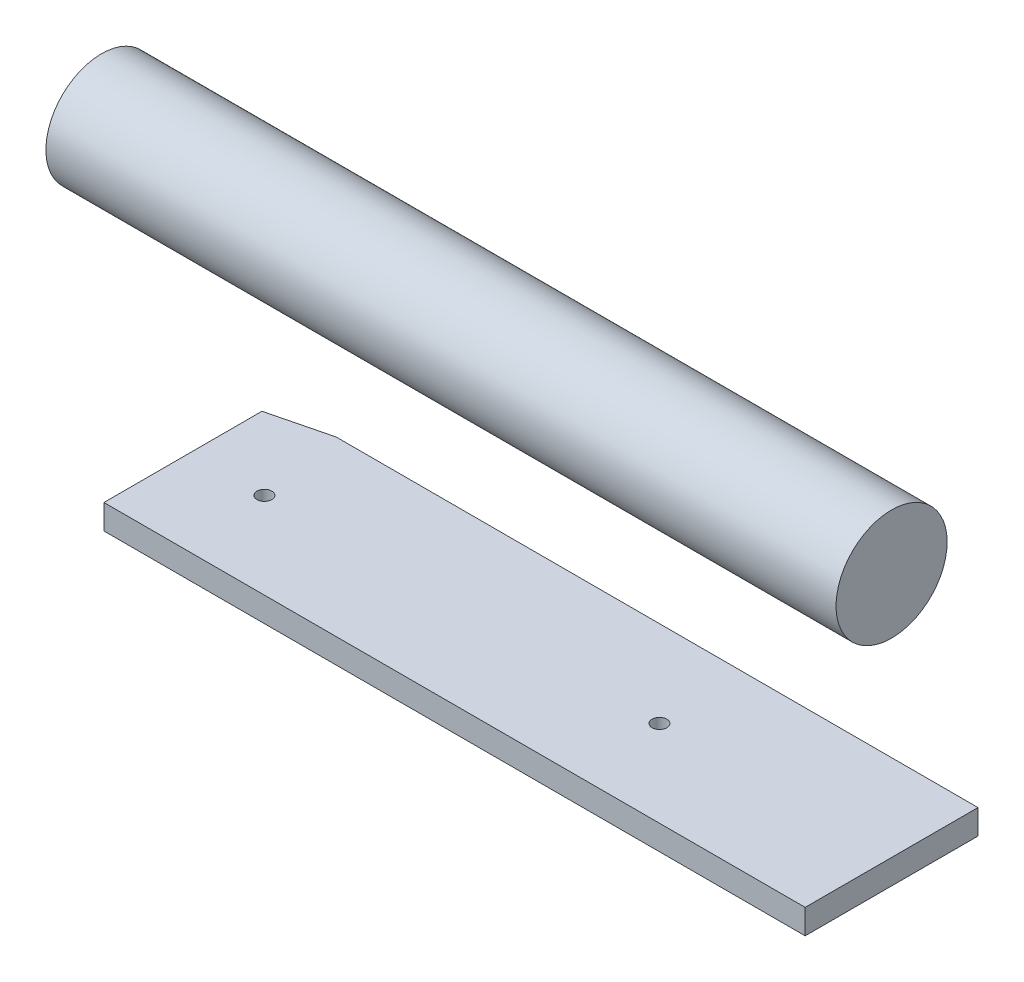
ISO-10303-21;
HEADER;
FILE_DESCRIPTION(('STEP AP214'),'2;1');
FILE_NAME('part.step','',(''),(''),'','','');
FILE_SCHEMA(('AUTOMOTIVE_DESIGN { 1 0 10303 214 1 1 1 1 }'));
ENDSEC;
DATA;
#1=APPLICATION_CONTEXT('core data for automotive mechanical design processes');
#2=APPLICATION_PROTOCOL_DEFINITION('international standard','automotive_design',2000,#1);
#3=PRODUCT_CONTEXT('',#1,'mechanical');
#4=PRODUCT('Part','Part','',(#3));
#5=PRODUCT_RELATED_PRODUCT_CATEGORY('part','',(#4));
#6=PRODUCT_DEFINITION_FORMATION('','',#4);
#7=PRODUCT_DEFINITION_CONTEXT('part definition',#1,'design');
#8=PRODUCT_DEFINITION('design','',#6,#7);
#9=PRODUCT_DEFINITION_SHAPE('','',#8);
#10=(LENGTH_UNIT() NAMED_UNIT(*) SI_UNIT(.MILLI.,.METRE.));
#11=(NAMED_UNIT(*) PLANE_ANGLE_UNIT() SI_UNIT($,.RADIAN.));
#12=(NAMED_UNIT(*) SI_UNIT($,.STERADIAN.) SOLID_ANGLE_UNIT());
#13=UNCERTAINTY_MEASURE_WITH_UNIT(LENGTH_MEASURE(1.E-05),#10,'distance_accuracy_value','');
#14=(GEOMETRIC_REPRESENTATION_CONTEXT(3) GLOBAL_UNCERTAINTY_ASSIGNED_CONTEXT((#13)) GLOBAL_UNIT_ASSIGNED_CONTEXT((#10,
#11,#12)) REPRESENTATION_CONTEXT('',''));
#15=CARTESIAN_POINT('',(0.,0.,0.));
#16=DIRECTION('',(0.,0.,1.));
#17=DIRECTION('',(1.,0.,0.));
#18=AXIS2_PLACEMENT_3D('',#15,#16,#17);
#19=CARTESIAN_POINT('',(0.,5.,0.));
#20=DIRECTION('',(0.,1.,0.));
#21=DIRECTION('',(0.,0.,1.));
#22=AXIS2_PLACEMENT_3D('',#19,#20,#21);
#23=PLANE('',#22);
#24=CARTESIAN_POINT('',(33.,5.,0.));
#25=DIRECTION('',(0.,1.,0.));
#26=DIRECTION('',(0.,0.,1.));
#27=AXIS2_PLACEMENT_3D('',#24,#25,#26);
#28=CIRCLE('',#27,1.5);
#29=CARTESIAN_POINT('',(33.,5.,1.50000000000002));
#30=VERTEX_POINT('',#29);
#31=EDGE_CURVE('E121',#30,#30,#28,.T.);
#32=ORIENTED_EDGE('',*,*,#31,.F.);
#33=EDGE_LOOP('',(#32));
#34=FACE_BOUND('',#33,.T.);
#35=DIRECTION('',(0.,0.,-1.));
#36=VECTOR('',#35,1.);
#37=CARTESIAN_POINT('',(160.,5.,17.5));
#38=LINE('',#37,#36);
#39=CARTESIAN_POINT('',(160.,5.,17.5));
#40=VERTEX_POINT('',#39);
#41=CARTESIAN_POINT('',(160.,5.,-17.5));
#42=VERTEX_POINT('',#41);
#43=EDGE_CURVE('E126',#40,#42,#38,.T.);
#44=ORIENTED_EDGE('',*,*,#43,.T.);
#45=DIRECTION('',(-1.,0.,0.));
#46=VECTOR('',#45,1.);
#47=CARTESIAN_POINT('',(160.,5.,-17.5));
#48=LINE('',#47,#46);
#49=CARTESIAN_POINT('',(30.0323428006067,5.,-17.5));
#50=VERTEX_POINT('',#49);
#51=EDGE_CURVE('E93',#42,#50,#48,.T.);
#52=ORIENTED_EDGE('',*,*,#51,.T.);
#53=DIRECTION('',(-0.970295726275993,0.,0.241921895599681));
#54=VECTOR('',#53,1.);
#55=CARTESIAN_POINT('',(18.,5.,-14.5));
#56=LINE('',#55,#54);
#57=CARTESIAN_POINT('',(18.,5.,-14.5));
#58=VERTEX_POINT('',#57);
#59=EDGE_CURVE('E97',#50,#58,#56,.T.);
#60=ORIENTED_EDGE('',*,*,#59,.T.);
#61=DIRECTION('',(0.,0.,1.));
#62=VECTOR('',#61,1.);
#63=CARTESIAN_POINT('',(18.,5.,-14.5));
#64=LINE('',#63,#62);
#65=CARTESIAN_POINT('',(18.,5.,17.5));
#66=VERTEX_POINT('',#65);
#67=EDGE_CURVE('E101',#58,#66,#64,.T.);
#68=ORIENTED_EDGE('',*,*,#67,.T.);
#69=DIRECTION('',(1.,0.,0.));
#70=VECTOR('',#69,1.);
#71=CARTESIAN_POINT('',(18.,5.,17.5));
#72=LINE('',#71,#70);
#73=EDGE_CURVE('E59',#66,#40,#72,.T.);
#74=ORIENTED_EDGE('',*,*,#73,.T.);
#75=EDGE_LOOP('',(#44,#52,#60,#68,#74));
#76=FACE_BOUND('',#75,.T.);
#77=CARTESIAN_POINT('',(113.,5.,0.));
#78=DIRECTION('',(0.,1.,0.));
#79=DIRECTION('',(0.,0.,1.));
#80=AXIS2_PLACEMENT_3D('',#77,#78,#79);
#81=CIRCLE('',#80,1.5);
#82=CARTESIAN_POINT('',(113.,5.,1.50000000000001));
#83=VERTEX_POINT('',#82);
#84=EDGE_CURVE('E164',#83,#83,#81,.T.);
#85=ORIENTED_EDGE('',*,*,#84,.F.);
#86=EDGE_LOOP('',(#85));
#87=FACE_BOUND('',#86,.T.);
#88=ADVANCED_FACE('F42',(#34,#76,#87),#23,.T.);
#89=CARTESIAN_POINT('',(0.,0.,0.));
#90=DIRECTION('',(0.,1.,0.));
#91=DIRECTION('',(0.,0.,1.));
#92=AXIS2_PLACEMENT_3D('',#89,#90,#91);
#93=PLANE('',#92);
#94=CARTESIAN_POINT('',(33.,0.,0.));
#95=DIRECTION('',(0.,1.,0.));
#96=DIRECTION('',(0.,0.,1.));
#97=AXIS2_PLACEMENT_3D('',#94,#95,#96);
#98=CIRCLE('',#97,1.5);
#99=CARTESIAN_POINT('',(33.,0.,1.50000000000002));
#100=VERTEX_POINT('',#99);
#101=EDGE_CURVE('E169',#100,#100,#98,.T.);
#102=ORIENTED_EDGE('',*,*,#101,.T.);
#103=EDGE_LOOP('',(#102));
#104=FACE_BOUND('',#103,.T.);
#105=DIRECTION('',(0.,0.,-1.));
#106=VECTOR('',#105,1.);
#107=CARTESIAN_POINT('',(160.,0.,17.5));
#108=LINE('',#107,#106);
#109=CARTESIAN_POINT('',(160.,0.,17.5));
#110=VERTEX_POINT('',#109);
#111=CARTESIAN_POINT('',(160.,0.,-17.5));
#112=VERTEX_POINT('',#111);
#113=EDGE_CURVE('E117',#110,#112,#108,.T.);
#114=ORIENTED_EDGE('',*,*,#113,.F.);
#115=DIRECTION('',(1.,0.,0.));
#116=VECTOR('',#115,1.);
#117=CARTESIAN_POINT('',(18.,0.,17.5));
#118=LINE('',#117,#116);
#119=CARTESIAN_POINT('',(18.,0.,17.5));
#120=VERTEX_POINT('',#119);
#121=EDGE_CURVE('E85',#120,#110,#118,.T.);
#122=ORIENTED_EDGE('',*,*,#121,.F.);
#123=DIRECTION('',(0.,0.,1.));
#124=VECTOR('',#123,1.);
#125=CARTESIAN_POINT('',(18.,0.,-14.5));
#126=LINE('',#125,#124);
#127=CARTESIAN_POINT('',(18.,0.,-14.5));
#128=VERTEX_POINT('',#127);
#129=EDGE_CURVE('E79',#128,#120,#126,.T.);
#130=ORIENTED_EDGE('',*,*,#129,.F.);
#131=DIRECTION('',(-0.970295726275993,0.,0.241921895599681));
#132=VECTOR('',#131,1.);
#133=CARTESIAN_POINT('',(18.,0.,-14.5));
#134=LINE('',#133,#132);
#135=CARTESIAN_POINT('',(30.0323428006067,0.,-17.5));
#136=VERTEX_POINT('',#135);
#137=EDGE_CURVE('E108',#136,#128,#134,.T.);
#138=ORIENTED_EDGE('',*,*,#137,.F.);
#139=DIRECTION('',(-1.,0.,0.));
#140=VECTOR('',#139,1.);
#141=CARTESIAN_POINT('',(160.,0.,-17.5));
#142=LINE('',#141,#140);
#143=EDGE_CURVE('E120',#112,#136,#142,.T.);
#144=ORIENTED_EDGE('',*,*,#143,.F.);
#145=EDGE_LOOP('',(#114,#122,#130,#138,#144));
#146=FACE_BOUND('',#145,.T.);
#147=CARTESIAN_POINT('',(113.,0.,0.));
#148=DIRECTION('',(0.,1.,0.));
#149=DIRECTION('',(0.,0.,1.));
#150=AXIS2_PLACEMENT_3D('',#147,#148,#149);
#151=CIRCLE('',#150,1.5);
#152=CARTESIAN_POINT('',(113.,0.,1.50000000000001));
#153=VERTEX_POINT('',#152);
#154=EDGE_CURVE('E167',#153,#153,#151,.T.);
#155=ORIENTED_EDGE('',*,*,#154,.T.);
#156=EDGE_LOOP('',(#155));
#157=FACE_BOUND('',#156,.T.);
#158=ADVANCED_FACE('F130',(#104,#146,#157),#93,.F.);
#159=CARTESIAN_POINT('',(160.,5.,17.5));
#160=DIRECTION('',(-1.,0.,0.));
#161=DIRECTION('',(0.,0.,1.));
#162=AXIS2_PLACEMENT_3D('',#159,#160,#161);
#163=PLANE('',#162);
#164=ORIENTED_EDGE('',*,*,#113,.T.);
#165=DIRECTION('',(0.,-1.,0.));
#166=VECTOR('',#165,1.);
#167=CARTESIAN_POINT('',(160.,5.,-17.5));
#168=LINE('',#167,#166);
#169=EDGE_CURVE('E12',#42,#112,#168,.T.);
#170=ORIENTED_EDGE('',*,*,#169,.F.);
#171=ORIENTED_EDGE('',*,*,#43,.F.);
#172=DIRECTION('',(0.,-1.,0.));
#173=VECTOR('',#172,1.);
#174=CARTESIAN_POINT('',(160.,5.,17.5));
#175=LINE('',#174,#173);
#176=EDGE_CURVE('E113',#40,#110,#175,.T.);
#177=ORIENTED_EDGE('',*,*,#176,.T.);
#178=EDGE_LOOP('',(#164,#170,#171,#177));
#179=FACE_BOUND('',#178,.T.);
#180=ADVANCED_FACE('F44',(#179),#163,.F.);
#181=CARTESIAN_POINT('',(160.,5.,-17.5));
#182=DIRECTION('',(0.,0.,1.));
#183=DIRECTION('',(1.,0.,0.));
#184=AXIS2_PLACEMENT_3D('',#181,#182,#183);
#185=PLANE('',#184);
#186=ORIENTED_EDGE('',*,*,#143,.T.);
#187=DIRECTION('',(0.,-1.,0.));
#188=VECTOR('',#187,1.);
#189=CARTESIAN_POINT('',(30.0323428006067,5.,-17.5));
#190=LINE('',#189,#188);
#191=EDGE_CURVE('E51',#50,#136,#190,.T.);
#192=ORIENTED_EDGE('',*,*,#191,.F.);
#193=ORIENTED_EDGE('',*,*,#51,.F.);
#194=ORIENTED_EDGE('',*,*,#169,.T.);
#195=EDGE_LOOP('',(#186,#192,#193,#194));
#196=FACE_BOUND('',#195,.T.);
#197=ADVANCED_FACE('F201',(#196),#185,.F.);
#198=CARTESIAN_POINT('',(18.,5.,-14.5));
#199=DIRECTION('',(0.241921895599681,0.,0.970295726275993));
#200=DIRECTION('',(0.970295726275993,0.,-0.241921895599681));
#201=AXIS2_PLACEMENT_3D('',#198,#199,#200);
#202=PLANE('',#201);
#203=ORIENTED_EDGE('',*,*,#137,.T.);
#204=DIRECTION('',(0.,-1.,0.));
#205=VECTOR('',#204,1.);
#206=CARTESIAN_POINT('',(18.,5.,-14.5));
#207=LINE('',#206,#205);
#208=EDGE_CURVE('E105',#58,#128,#207,.T.);
#209=ORIENTED_EDGE('',*,*,#208,.F.);
#210=ORIENTED_EDGE('',*,*,#59,.F.);
#211=ORIENTED_EDGE('',*,*,#191,.T.);
#212=EDGE_LOOP('',(#203,#209,#210,#211));
#213=FACE_BOUND('',#212,.T.);
#214=ADVANCED_FACE('F106',(#213),#202,.F.);
#215=CARTESIAN_POINT('',(18.,5.,-14.5));
#216=DIRECTION('',(1.,0.,0.));
#217=DIRECTION('',(0.,0.,-1.));
#218=AXIS2_PLACEMENT_3D('',#215,#216,#217);
#219=PLANE('',#218);
#220=ORIENTED_EDGE('',*,*,#129,.T.);
#221=DIRECTION('',(0.,-1.,0.));
#222=VECTOR('',#221,1.);
#223=CARTESIAN_POINT('',(18.,5.,17.5));
#224=LINE('',#223,#222);
#225=EDGE_CURVE('E109',#66,#120,#224,.T.);
#226=ORIENTED_EDGE('',*,*,#225,.F.);
#227=ORIENTED_EDGE('',*,*,#67,.F.);
#228=ORIENTED_EDGE('',*,*,#208,.T.);
#229=EDGE_LOOP('',(#220,#226,#227,#228));
#230=FACE_BOUND('',#229,.T.);
#231=ADVANCED_FACE('F111',(#230),#219,.F.);
#232=CARTESIAN_POINT('',(18.,5.,17.5));
#233=DIRECTION('',(0.,0.,-1.));
#234=DIRECTION('',(-1.,0.,0.));
#235=AXIS2_PLACEMENT_3D('',#232,#233,#234);
#236=PLANE('',#235);
#237=ORIENTED_EDGE('',*,*,#121,.T.);
#238=ORIENTED_EDGE('',*,*,#176,.F.);
#239=ORIENTED_EDGE('',*,*,#73,.F.);
#240=ORIENTED_EDGE('',*,*,#225,.T.);
#241=EDGE_LOOP('',(#237,#238,#239,#240));
#242=FACE_BOUND('',#241,.T.);
#243=ADVANCED_FACE('F135',(#242),#236,.F.);
#244=CARTESIAN_POINT('',(33.,5.,0.));
#245=DIRECTION('',(0.,-1.,0.));
#246=DIRECTION('',(0.,0.,-1.));
#247=AXIS2_PLACEMENT_3D('',#244,#245,#246);
#248=CYLINDRICAL_SURFACE('',#247,1.5);
#249=ORIENTED_EDGE('',*,*,#31,.T.);
#250=EDGE_LOOP('',(#249));
#251=FACE_BOUND('',#250,.T.);
#252=ORIENTED_EDGE('',*,*,#101,.F.);
#253=EDGE_LOOP('',(#252));
#254=FACE_BOUND('',#253,.T.);
#255=ADVANCED_FACE('F137',(#251,#254),#248,.F.);
#256=CARTESIAN_POINT('',(113.,5.,0.));
#257=DIRECTION('',(0.,-1.,0.));
#258=DIRECTION('',(0.,0.,-1.));
#259=AXIS2_PLACEMENT_3D('',#256,#257,#258);
#260=CYLINDRICAL_SURFACE('',#259,1.5);
#261=ORIENTED_EDGE('',*,*,#84,.T.);
#262=EDGE_LOOP('',(#261));
#263=FACE_BOUND('',#262,.T.);
#264=ORIENTED_EDGE('',*,*,#154,.F.);
#265=EDGE_LOOP('',(#264));
#266=FACE_BOUND('',#265,.T.);
#267=ADVANCED_FACE('F143',(#263,#266),#260,.F.);
#268=CLOSED_SHELL('',(#88,#158,#180,#197,#214,#231,#243,#255,#267));
#269=MANIFOLD_SOLID_BREP('B2',#268);
#270=CARTESIAN_POINT('',(160.,54.7,0.));
#271=DIRECTION('',(-1.,0.,0.));
#272=DIRECTION('',(0.,0.,1.));
#273=AXIS2_PLACEMENT_3D('',#270,#271,#272);
#274=CYLINDRICAL_SURFACE('',#273,11.25);
#275=CARTESIAN_POINT('',(160.,54.7,0.));
#276=DIRECTION('',(1.,0.,0.));
#277=DIRECTION('',(0.,0.,-1.));
#278=AXIS2_PLACEMENT_3D('',#275,#276,#277);
#279=CIRCLE('',#278,11.25);
#280=CARTESIAN_POINT('',(160.,54.7,-11.25));
#281=VERTEX_POINT('',#280);
#282=EDGE_CURVE('E41',#281,#281,#279,.T.);
#283=ORIENTED_EDGE('',*,*,#282,.F.);
#284=EDGE_LOOP('',(#283));
#285=FACE_BOUND('',#284,.T.);
#286=CARTESIAN_POINT('',(0.,54.7,0.));
#287=DIRECTION('',(1.,0.,0.));
#288=DIRECTION('',(0.,0.,-1.));
#289=AXIS2_PLACEMENT_3D('',#286,#287,#288);
#290=CIRCLE('',#289,11.25);
#291=CARTESIAN_POINT('',(0.,54.7,-11.25));
#292=VERTEX_POINT('',#291);
#293=EDGE_CURVE('E236',#292,#292,#290,.T.);
#294=ORIENTED_EDGE('',*,*,#293,.T.);
#295=EDGE_LOOP('',(#294));
#296=FACE_BOUND('',#295,.T.);
#297=ADVANCED_FACE('F233',(#285,#296),#274,.T.);
#298=CARTESIAN_POINT('',(160.,54.7,0.));
#299=DIRECTION('',(1.,0.,0.));
#300=DIRECTION('',(0.,0.,-1.));
#301=AXIS2_PLACEMENT_3D('',#298,#299,#300);
#302=PLANE('',#301);
#303=ORIENTED_EDGE('',*,*,#282,.T.);
#304=EDGE_LOOP('',(#303));
#305=FACE_BOUND('',#304,.T.);
#306=ADVANCED_FACE('F248',(#305),#302,.T.);
#307=CARTESIAN_POINT('',(0.,54.7,0.));
#308=DIRECTION('',(1.,0.,0.));
#309=DIRECTION('',(0.,0.,-1.));
#310=AXIS2_PLACEMENT_3D('',#307,#308,#309);
#311=PLANE('',#310);
#312=ORIENTED_EDGE('',*,*,#293,.F.);
#313=EDGE_LOOP('',(#312));
#314=FACE_BOUND('',#313,.T.);
#315=ADVANCED_FACE('F246',(#314),#311,.F.);
#316=CLOSED_SHELL('',(#297,#306,#315));
#317=MANIFOLD_SOLID_BREP('B6',#316);
#318=ADVANCED_BREP_SHAPE_REPRESENTATION('',(#18,#269,#317),#14);
#319=SHAPE_DEFINITION_REPRESENTATION(#9,#318);
ENDSEC;
END-ISO-10303-21;
